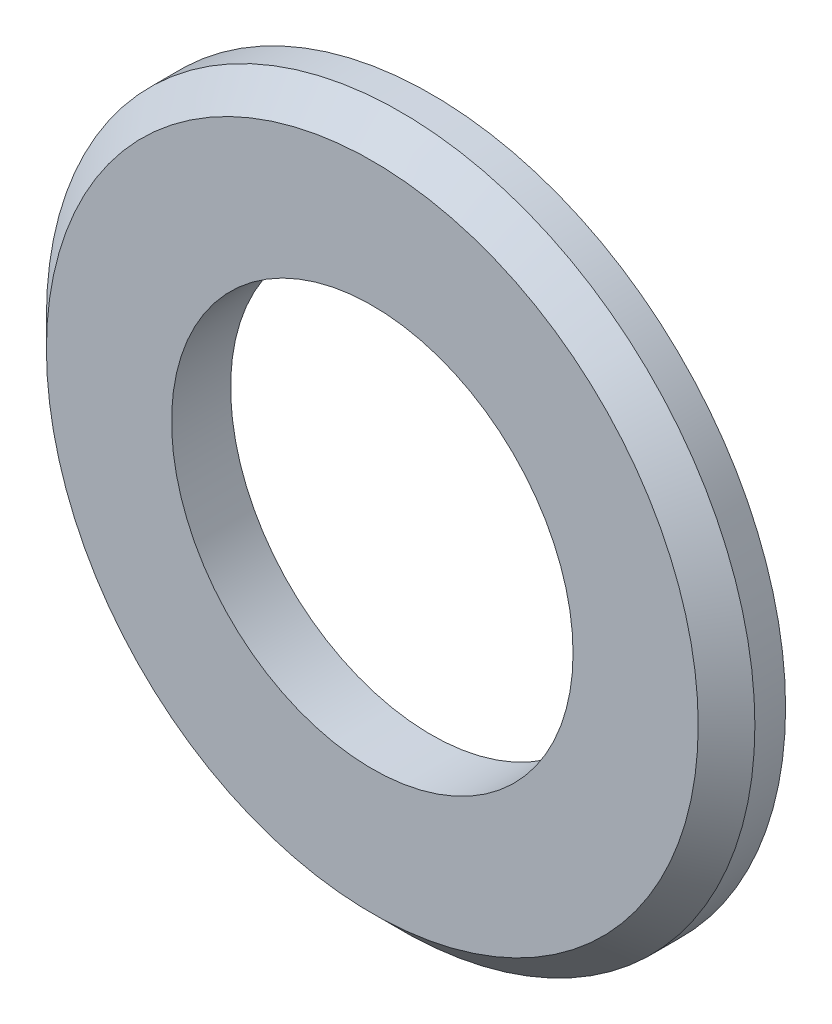
ISO-10303-21;
HEADER;
FILE_DESCRIPTION(('STEP AP214'),'2;1');
FILE_NAME('part.step','',(''),(''),'','','');
FILE_SCHEMA(('AUTOMOTIVE_DESIGN { 1 0 10303 214 1 1 1 1 }'));
ENDSEC;
DATA;
#1=APPLICATION_CONTEXT('core data for automotive mechanical design processes');
#2=APPLICATION_PROTOCOL_DEFINITION('international standard','automotive_design',2000,#1);
#3=PRODUCT_CONTEXT('',#1,'mechanical');
#4=PRODUCT('Part','Part','',(#3));
#5=PRODUCT_RELATED_PRODUCT_CATEGORY('part','',(#4));
#6=PRODUCT_DEFINITION_FORMATION('','',#4);
#7=PRODUCT_DEFINITION_CONTEXT('part definition',#1,'design');
#8=PRODUCT_DEFINITION('design','',#6,#7);
#9=PRODUCT_DEFINITION_SHAPE('','',#8);
#10=(LENGTH_UNIT() NAMED_UNIT(*) SI_UNIT(.MILLI.,.METRE.));
#11=(NAMED_UNIT(*) PLANE_ANGLE_UNIT() SI_UNIT($,.RADIAN.));
#12=(NAMED_UNIT(*) SI_UNIT($,.STERADIAN.) SOLID_ANGLE_UNIT());
#13=UNCERTAINTY_MEASURE_WITH_UNIT(LENGTH_MEASURE(1.E-05),#10,'distance_accuracy_value','');
#14=(GEOMETRIC_REPRESENTATION_CONTEXT(3) GLOBAL_UNCERTAINTY_ASSIGNED_CONTEXT((#13)) GLOBAL_UNIT_ASSIGNED_CONTEXT((#10,
#11,#12)) REPRESENTATION_CONTEXT('',''));
#15=CARTESIAN_POINT('',(0.,0.,0.));
#16=DIRECTION('',(0.,0.,1.));
#17=DIRECTION('',(1.,0.,0.));
#18=AXIS2_PLACEMENT_3D('',#15,#16,#17);
#19=CARTESIAN_POINT('',(0.,0.,2.5));
#20=DIRECTION('',(0.,0.,1.));
#21=DIRECTION('',(1.,0.,0.));
#22=AXIS2_PLACEMENT_3D('',#19,#20,#21);
#23=PLANE('',#22);
#24=CARTESIAN_POINT('',(0.,0.,2.5));
#25=DIRECTION('',(0.,0.,1.));
#26=DIRECTION('',(1.,0.,0.));
#27=AXIS2_PLACEMENT_3D('',#24,#25,#26);
#28=CIRCLE('',#27,13.8);
#29=CARTESIAN_POINT('',(13.8,0.,2.5));
#30=VERTEX_POINT('',#29);
#31=EDGE_CURVE('E52',#30,#30,#28,.T.);
#32=ORIENTED_EDGE('',*,*,#31,.T.);
#33=EDGE_LOOP('',(#32));
#34=FACE_BOUND('',#33,.T.);
#35=CARTESIAN_POINT('',(0.,0.,2.5));
#36=DIRECTION('',(0.,0.,1.));
#37=DIRECTION('',(1.,0.,0.));
#38=AXIS2_PLACEMENT_3D('',#35,#36,#37);
#39=CIRCLE('',#38,8.5);
#40=CARTESIAN_POINT('',(8.5,0.,2.5));
#41=VERTEX_POINT('',#40);
#42=EDGE_CURVE('E60',#41,#41,#39,.T.);
#43=ORIENTED_EDGE('',*,*,#42,.F.);
#44=EDGE_LOOP('',(#43));
#45=FACE_BOUND('',#44,.T.);
#46=ADVANCED_FACE('F44',(#34,#45),#23,.T.);
#47=CARTESIAN_POINT('',(0.,0.,0.));
#48=DIRECTION('',(0.,0.,1.));
#49=DIRECTION('',(1.,0.,0.));
#50=AXIS2_PLACEMENT_3D('',#47,#48,#49);
#51=PLANE('',#50);
#52=CARTESIAN_POINT('',(0.,0.,0.));
#53=DIRECTION('',(0.,0.,1.));
#54=DIRECTION('',(1.,0.,0.));
#55=AXIS2_PLACEMENT_3D('',#52,#53,#54);
#56=CIRCLE('',#55,15.);
#57=CARTESIAN_POINT('',(15.,0.,0.));
#58=VERTEX_POINT('',#57);
#59=EDGE_CURVE('E56',#58,#58,#56,.T.);
#60=ORIENTED_EDGE('',*,*,#59,.F.);
#61=EDGE_LOOP('',(#60));
#62=FACE_BOUND('',#61,.T.);
#63=CARTESIAN_POINT('',(0.,0.,0.));
#64=DIRECTION('',(0.,0.,1.));
#65=DIRECTION('',(1.,0.,0.));
#66=AXIS2_PLACEMENT_3D('',#63,#64,#65);
#67=CIRCLE('',#66,8.5);
#68=CARTESIAN_POINT('',(8.5,0.,0.));
#69=VERTEX_POINT('',#68);
#70=EDGE_CURVE('E63',#69,#69,#67,.T.);
#71=ORIENTED_EDGE('',*,*,#70,.T.);
#72=EDGE_LOOP('',(#71));
#73=FACE_BOUND('',#72,.T.);
#74=ADVANCED_FACE('F73',(#62,#73),#51,.F.);
#75=CARTESIAN_POINT('',(0.,0.,2.5));
#76=DIRECTION('',(0.,0.,-1.));
#77=DIRECTION('',(-1.,0.,0.));
#78=AXIS2_PLACEMENT_3D('',#75,#76,#77);
#79=CYLINDRICAL_SURFACE('',#78,15.);
#80=CARTESIAN_POINT('',(0.,0.,1.3));
#81=DIRECTION('',(0.,0.,1.));
#82=DIRECTION('',(1.,0.,0.));
#83=AXIS2_PLACEMENT_3D('',#80,#81,#82);
#84=CIRCLE('',#83,15.);
#85=CARTESIAN_POINT('',(15.,0.,1.3));
#86=VERTEX_POINT('',#85);
#87=EDGE_CURVE('E10',#86,#86,#84,.F.);
#88=ORIENTED_EDGE('',*,*,#87,.T.);
#89=EDGE_LOOP('',(#88));
#90=FACE_BOUND('',#89,.T.);
#91=ORIENTED_EDGE('',*,*,#59,.T.);
#92=EDGE_LOOP('',(#91));
#93=FACE_BOUND('',#92,.T.);
#94=ADVANCED_FACE('F78',(#90,#93),#79,.T.);
#95=CARTESIAN_POINT('',(0.,0.,2.5));
#96=DIRECTION('',(0.,0.,-1.));
#97=DIRECTION('',(-1.,0.,0.));
#98=AXIS2_PLACEMENT_3D('',#95,#96,#97);
#99=CYLINDRICAL_SURFACE('',#98,8.5);
#100=ORIENTED_EDGE('',*,*,#42,.T.);
#101=EDGE_LOOP('',(#100));
#102=FACE_BOUND('',#101,.T.);
#103=ORIENTED_EDGE('',*,*,#70,.F.);
#104=EDGE_LOOP('',(#103));
#105=FACE_BOUND('',#104,.T.);
#106=ADVANCED_FACE('F69',(#102,#105),#99,.F.);
#107=CARTESIAN_POINT('',(0.,0.,2.5));
#108=DIRECTION('',(0.,0.,-1.));
#109=DIRECTION('',(-1.,0.,0.));
#110=AXIS2_PLACEMENT_3D('',#107,#108,#109);
#111=CONICAL_SURFACE('',#110,13.8,0.785398163397446);
#112=ORIENTED_EDGE('',*,*,#87,.F.);
#113=EDGE_LOOP('',(#112));
#114=FACE_BOUND('',#113,.T.);
#115=ORIENTED_EDGE('',*,*,#31,.F.);
#116=EDGE_LOOP('',(#115));
#117=FACE_BOUND('',#116,.T.);
#118=ADVANCED_FACE('F47',(#114,#117),#111,.T.);
#119=CLOSED_SHELL('',(#46,#74,#94,#106,#118));
#120=MANIFOLD_SOLID_BREP('B2',#119);
#121=ADVANCED_BREP_SHAPE_REPRESENTATION('',(#18,#120),#14);
#122=SHAPE_DEFINITION_REPRESENTATION(#9,#121);
ENDSEC;
END-ISO-10303-21;
